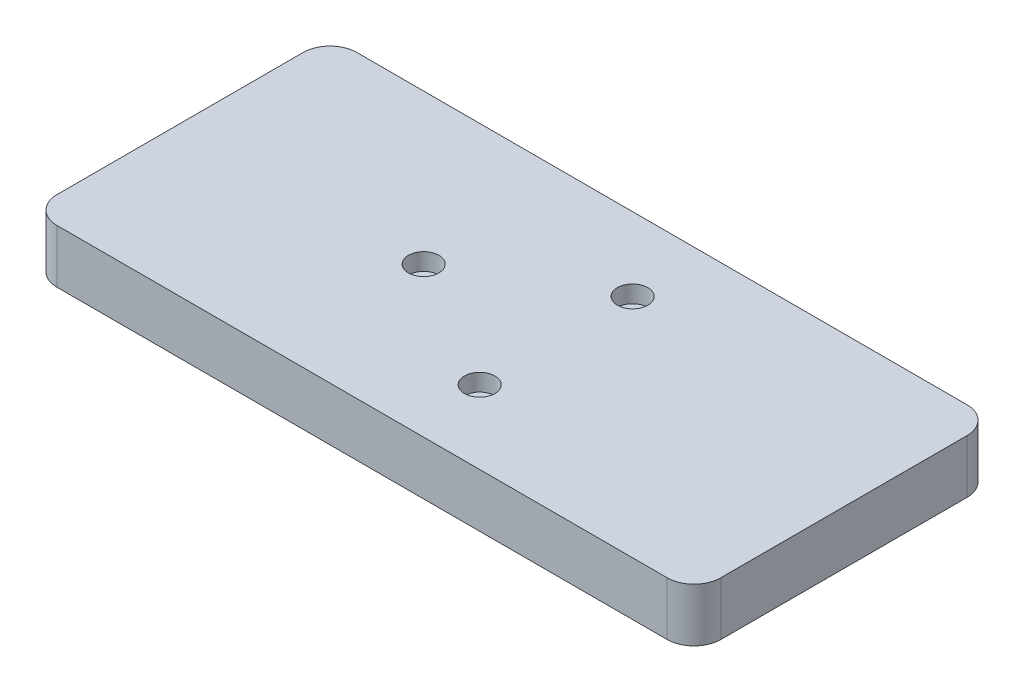
ISO-10303-21;
HEADER;
FILE_DESCRIPTION(('STEP AP214'),'2;1');
FILE_NAME('part.step','',(''),(''),'','','');
FILE_SCHEMA(('AUTOMOTIVE_DESIGN { 1 0 10303 214 1 1 1 1 }'));
ENDSEC;
DATA;
#1=APPLICATION_CONTEXT('core data for automotive mechanical design processes');
#2=APPLICATION_PROTOCOL_DEFINITION('international standard','automotive_design',2000,#1);
#3=PRODUCT_CONTEXT('',#1,'mechanical');
#4=PRODUCT('Part','Part','',(#3));
#5=PRODUCT_RELATED_PRODUCT_CATEGORY('part','',(#4));
#6=PRODUCT_DEFINITION_FORMATION('','',#4);
#7=PRODUCT_DEFINITION_CONTEXT('part definition',#1,'design');
#8=PRODUCT_DEFINITION('design','',#6,#7);
#9=PRODUCT_DEFINITION_SHAPE('','',#8);
#10=(LENGTH_UNIT() NAMED_UNIT(*) SI_UNIT(.MILLI.,.METRE.));
#11=(NAMED_UNIT(*) PLANE_ANGLE_UNIT() SI_UNIT($,.RADIAN.));
#12=(NAMED_UNIT(*) SI_UNIT($,.STERADIAN.) SOLID_ANGLE_UNIT());
#13=UNCERTAINTY_MEASURE_WITH_UNIT(LENGTH_MEASURE(1.E-05),#10,'distance_accuracy_value','');
#14=(GEOMETRIC_REPRESENTATION_CONTEXT(3) GLOBAL_UNCERTAINTY_ASSIGNED_CONTEXT((#13)) GLOBAL_UNIT_ASSIGNED_CONTEXT((#10,
#11,#12)) REPRESENTATION_CONTEXT('',''));
#15=CARTESIAN_POINT('',(0.,0.,0.));
#16=DIRECTION('',(0.,0.,1.));
#17=DIRECTION('',(1.,0.,0.));
#18=AXIS2_PLACEMENT_3D('',#15,#16,#17);
#19=CARTESIAN_POINT('',(8.24999999999997,-0.000999999999999265,14.2894191624432));
#20=DIRECTION('',(0.,1.,0.));
#21=DIRECTION('',(0.,0.,1.));
#22=AXIS2_PLACEMENT_3D('',#19,#20,#21);
#23=CYLINDRICAL_SURFACE('',#22,1.55);
#24=CARTESIAN_POINT('',(8.24999999999997,0.,14.2894191624432));
#25=DIRECTION('',(0.,1.,0.));
#26=DIRECTION('',(0.,0.,1.));
#27=AXIS2_PLACEMENT_3D('',#24,#25,#26);
#28=CIRCLE('',#27,1.55);
#29=CARTESIAN_POINT('',(8.24999999999997,0.,15.8394191624432));
#30=VERTEX_POINT('',#29);
#31=EDGE_CURVE('E170',#30,#30,#28,.F.);
#32=ORIENTED_EDGE('',*,*,#31,.T.);
#33=EDGE_LOOP('',(#32));
#34=FACE_BOUND('',#33,.T.);
#35=CARTESIAN_POINT('',(8.24999999999997,6.8,14.2894191624432));
#36=DIRECTION('',(0.,1.,0.));
#37=DIRECTION('',(0.,0.,1.));
#38=AXIS2_PLACEMENT_3D('',#35,#36,#37);
#39=CIRCLE('',#38,1.55);
#40=CARTESIAN_POINT('',(8.24999999999997,6.8,15.8394191624432));
#41=VERTEX_POINT('',#40);
#42=EDGE_CURVE('E38',#41,#41,#39,.F.);
#43=ORIENTED_EDGE('',*,*,#42,.F.);
#44=EDGE_LOOP('',(#43));
#45=FACE_BOUND('',#44,.T.);
#46=ADVANCED_FACE('F34',(#34,#45),#23,.F.);
#47=CARTESIAN_POINT('',(8.24999999999996,-0.000999999999999265,-14.2894191624433));
#48=DIRECTION('',(0.,1.,0.));
#49=DIRECTION('',(0.,0.,1.));
#50=AXIS2_PLACEMENT_3D('',#47,#48,#49);
#51=CYLINDRICAL_SURFACE('',#50,1.55);
#52=CARTESIAN_POINT('',(8.24999999999996,0.,-14.2894191624433));
#53=DIRECTION('',(0.,1.,0.));
#54=DIRECTION('',(0.,0.,1.));
#55=AXIS2_PLACEMENT_3D('',#52,#53,#54);
#56=CIRCLE('',#55,1.55);
#57=CARTESIAN_POINT('',(8.24999999999996,0.,-12.7394191624433));
#58=VERTEX_POINT('',#57);
#59=EDGE_CURVE('E174',#58,#58,#56,.F.);
#60=ORIENTED_EDGE('',*,*,#59,.T.);
#61=EDGE_LOOP('',(#60));
#62=FACE_BOUND('',#61,.T.);
#63=CARTESIAN_POINT('',(8.24999999999996,6.8,-14.2894191624433));
#64=DIRECTION('',(0.,1.,0.));
#65=DIRECTION('',(0.,0.,1.));
#66=AXIS2_PLACEMENT_3D('',#63,#64,#65);
#67=CIRCLE('',#66,1.55);
#68=CARTESIAN_POINT('',(8.24999999999996,6.8,-12.7394191624433));
#69=VERTEX_POINT('',#68);
#70=EDGE_CURVE('E164',#69,#69,#67,.F.);
#71=ORIENTED_EDGE('',*,*,#70,.F.);
#72=EDGE_LOOP('',(#71));
#73=FACE_BOUND('',#72,.T.);
#74=ADVANCED_FACE('F216',(#62,#73),#51,.F.);
#75=CARTESIAN_POINT('',(-16.5,-0.000999999999999265,0.));
#76=DIRECTION('',(0.,1.,0.));
#77=DIRECTION('',(0.,0.,1.));
#78=AXIS2_PLACEMENT_3D('',#75,#76,#77);
#79=CYLINDRICAL_SURFACE('',#78,1.55);
#80=CARTESIAN_POINT('',(-16.5,0.,0.));
#81=DIRECTION('',(0.,1.,0.));
#82=DIRECTION('',(0.,0.,1.));
#83=AXIS2_PLACEMENT_3D('',#80,#81,#82);
#84=CIRCLE('',#83,1.55);
#85=CARTESIAN_POINT('',(-16.5,0.,1.55));
#86=VERTEX_POINT('',#85);
#87=EDGE_CURVE('E134',#86,#86,#84,.F.);
#88=ORIENTED_EDGE('',*,*,#87,.T.);
#89=EDGE_LOOP('',(#88));
#90=FACE_BOUND('',#89,.T.);
#91=CARTESIAN_POINT('',(-16.5,6.8,0.));
#92=DIRECTION('',(0.,1.,0.));
#93=DIRECTION('',(0.,0.,1.));
#94=AXIS2_PLACEMENT_3D('',#91,#92,#93);
#95=CIRCLE('',#94,1.55);
#96=CARTESIAN_POINT('',(-16.5,6.8,1.55));
#97=VERTEX_POINT('',#96);
#98=EDGE_CURVE('E162',#97,#97,#95,.F.);
#99=ORIENTED_EDGE('',*,*,#98,.F.);
#100=EDGE_LOOP('',(#99));
#101=FACE_BOUND('',#100,.T.);
#102=ADVANCED_FACE('F221',(#90,#101),#79,.F.);
#103=CARTESIAN_POINT('',(-62.,10.,-28.));
#104=DIRECTION('',(0.,0.,1.));
#105=DIRECTION('',(1.,0.,0.));
#106=AXIS2_PLACEMENT_3D('',#103,#104,#105);
#107=PLANE('',#106);
#108=DIRECTION('',(-1.,0.,0.));
#109=VECTOR('',#108,1.);
#110=CARTESIAN_POINT('',(-62.,0.,-28.));
#111=LINE('',#110,#109);
#112=CARTESIAN_POINT('',(57.,0.,-28.));
#113=VERTEX_POINT('',#112);
#114=CARTESIAN_POINT('',(-57.,0.,-28.));
#115=VERTEX_POINT('',#114);
#116=EDGE_CURVE('E129',#113,#115,#111,.T.);
#117=ORIENTED_EDGE('',*,*,#116,.T.);
#118=DIRECTION('',(0.,-1.,0.));
#119=VECTOR('',#118,1.);
#120=CARTESIAN_POINT('',(-57.,10.,-28.));
#121=LINE('',#120,#119);
#122=CARTESIAN_POINT('',(-57.,10.,-28.));
#123=VERTEX_POINT('',#122);
#124=EDGE_CURVE('E107',#115,#123,#121,.F.);
#125=ORIENTED_EDGE('',*,*,#124,.T.);
#126=DIRECTION('',(-1.,0.,0.));
#127=VECTOR('',#126,1.);
#128=CARTESIAN_POINT('',(-62.,10.,-28.));
#129=LINE('',#128,#127);
#130=CARTESIAN_POINT('',(57.,10.,-28.));
#131=VERTEX_POINT('',#130);
#132=EDGE_CURVE('E139',#131,#123,#129,.T.);
#133=ORIENTED_EDGE('',*,*,#132,.F.);
#134=DIRECTION('',(0.,-1.,0.));
#135=VECTOR('',#134,1.);
#136=CARTESIAN_POINT('',(57.,10.,-28.));
#137=LINE('',#136,#135);
#138=EDGE_CURVE('E112',#131,#113,#137,.T.);
#139=ORIENTED_EDGE('',*,*,#138,.T.);
#140=EDGE_LOOP('',(#117,#125,#133,#139));
#141=FACE_BOUND('',#140,.T.);
#142=ADVANCED_FACE('F194',(#141),#107,.F.);
#143=CARTESIAN_POINT('',(-62.,10.,28.));
#144=DIRECTION('',(1.,0.,0.));
#145=DIRECTION('',(0.,0.,-1.));
#146=AXIS2_PLACEMENT_3D('',#143,#144,#145);
#147=PLANE('',#146);
#148=DIRECTION('',(0.,0.,1.));
#149=VECTOR('',#148,1.);
#150=CARTESIAN_POINT('',(-62.,10.,28.));
#151=LINE('',#150,#149);
#152=CARTESIAN_POINT('',(-62.,10.,-23.));
#153=VERTEX_POINT('',#152);
#154=CARTESIAN_POINT('',(-62.,10.,23.));
#155=VERTEX_POINT('',#154);
#156=EDGE_CURVE('E122',#153,#155,#151,.T.);
#157=ORIENTED_EDGE('',*,*,#156,.F.);
#158=DIRECTION('',(0.,-1.,0.));
#159=VECTOR('',#158,1.);
#160=CARTESIAN_POINT('',(-62.,10.,-23.));
#161=LINE('',#160,#159);
#162=CARTESIAN_POINT('',(-62.,0.,-23.));
#163=VERTEX_POINT('',#162);
#164=EDGE_CURVE('E106',#153,#163,#161,.T.);
#165=ORIENTED_EDGE('',*,*,#164,.T.);
#166=DIRECTION('',(0.,0.,1.));
#167=VECTOR('',#166,1.);
#168=CARTESIAN_POINT('',(-62.,0.,28.));
#169=LINE('',#168,#167);
#170=CARTESIAN_POINT('',(-62.,0.,23.));
#171=VERTEX_POINT('',#170);
#172=EDGE_CURVE('E119',#163,#171,#169,.T.);
#173=ORIENTED_EDGE('',*,*,#172,.T.);
#174=DIRECTION('',(0.,-1.,0.));
#175=VECTOR('',#174,1.);
#176=CARTESIAN_POINT('',(-62.,10.,23.));
#177=LINE('',#176,#175);
#178=EDGE_CURVE('E124',#171,#155,#177,.F.);
#179=ORIENTED_EDGE('',*,*,#178,.T.);
#180=EDGE_LOOP('',(#157,#165,#173,#179));
#181=FACE_BOUND('',#180,.T.);
#182=ADVANCED_FACE('F118',(#181),#147,.F.);
#183=CARTESIAN_POINT('',(-62.,10.,28.));
#184=DIRECTION('',(0.,0.,-1.));
#185=DIRECTION('',(-1.,0.,0.));
#186=AXIS2_PLACEMENT_3D('',#183,#184,#185);
#187=PLANE('',#186);
#188=DIRECTION('',(1.,0.,0.));
#189=VECTOR('',#188,1.);
#190=CARTESIAN_POINT('',(-62.,0.,28.));
#191=LINE('',#190,#189);
#192=CARTESIAN_POINT('',(-57.,0.,28.));
#193=VERTEX_POINT('',#192);
#194=CARTESIAN_POINT('',(57.,0.,28.));
#195=VERTEX_POINT('',#194);
#196=EDGE_CURVE('E128',#193,#195,#191,.T.);
#197=ORIENTED_EDGE('',*,*,#196,.T.);
#198=DIRECTION('',(0.,-1.,0.));
#199=VECTOR('',#198,1.);
#200=CARTESIAN_POINT('',(57.,10.,28.));
#201=LINE('',#200,#199);
#202=CARTESIAN_POINT('',(57.,10.,28.));
#203=VERTEX_POINT('',#202);
#204=EDGE_CURVE('E12',#195,#203,#201,.F.);
#205=ORIENTED_EDGE('',*,*,#204,.T.);
#206=DIRECTION('',(1.,0.,0.));
#207=VECTOR('',#206,1.);
#208=CARTESIAN_POINT('',(-62.,10.,28.));
#209=LINE('',#208,#207);
#210=CARTESIAN_POINT('',(-57.,10.,28.));
#211=VERTEX_POINT('',#210);
#212=EDGE_CURVE('E185',#211,#203,#209,.T.);
#213=ORIENTED_EDGE('',*,*,#212,.F.);
#214=DIRECTION('',(0.,-1.,0.));
#215=VECTOR('',#214,1.);
#216=CARTESIAN_POINT('',(-57.,10.,28.));
#217=LINE('',#216,#215);
#218=EDGE_CURVE('E43',#211,#193,#217,.T.);
#219=ORIENTED_EDGE('',*,*,#218,.T.);
#220=EDGE_LOOP('',(#197,#205,#213,#219));
#221=FACE_BOUND('',#220,.T.);
#222=ADVANCED_FACE('F201',(#221),#187,.F.);
#223=CARTESIAN_POINT('',(62.,10.,28.));
#224=DIRECTION('',(-1.,0.,0.));
#225=DIRECTION('',(0.,0.,1.));
#226=AXIS2_PLACEMENT_3D('',#223,#224,#225);
#227=PLANE('',#226);
#228=DIRECTION('',(0.,0.,-1.));
#229=VECTOR('',#228,1.);
#230=CARTESIAN_POINT('',(62.,0.,28.));
#231=LINE('',#230,#229);
#232=CARTESIAN_POINT('',(62.,0.,23.));
#233=VERTEX_POINT('',#232);
#234=CARTESIAN_POINT('',(62.,0.,-23.));
#235=VERTEX_POINT('',#234);
#236=EDGE_CURVE('E132',#233,#235,#231,.T.);
#237=ORIENTED_EDGE('',*,*,#236,.T.);
#238=DIRECTION('',(0.,-1.,0.));
#239=VECTOR('',#238,1.);
#240=CARTESIAN_POINT('',(62.,10.,-23.));
#241=LINE('',#240,#239);
#242=CARTESIAN_POINT('',(62.,10.,-23.));
#243=VERTEX_POINT('',#242);
#244=EDGE_CURVE('E51',#235,#243,#241,.F.);
#245=ORIENTED_EDGE('',*,*,#244,.T.);
#246=DIRECTION('',(0.,0.,-1.));
#247=VECTOR('',#246,1.);
#248=CARTESIAN_POINT('',(62.,10.,28.));
#249=LINE('',#248,#247);
#250=CARTESIAN_POINT('',(62.,10.,23.));
#251=VERTEX_POINT('',#250);
#252=EDGE_CURVE('E140',#251,#243,#249,.T.);
#253=ORIENTED_EDGE('',*,*,#252,.F.);
#254=DIRECTION('',(0.,-1.,0.));
#255=VECTOR('',#254,1.);
#256=CARTESIAN_POINT('',(62.,10.,23.));
#257=LINE('',#256,#255);
#258=EDGE_CURVE('E156',#251,#233,#257,.T.);
#259=ORIENTED_EDGE('',*,*,#258,.T.);
#260=EDGE_LOOP('',(#237,#245,#253,#259));
#261=FACE_BOUND('',#260,.T.);
#262=ADVANCED_FACE('F196',(#261),#227,.F.);
#263=CARTESIAN_POINT('',(0.,10.,0.));
#264=DIRECTION('',(0.,1.,0.));
#265=DIRECTION('',(0.,0.,1.));
#266=AXIS2_PLACEMENT_3D('',#263,#264,#265);
#267=PLANE('',#266);
#268=CARTESIAN_POINT('',(8.24999999999996,10.,-14.2894191624433));
#269=DIRECTION('',(0.,1.,0.));
#270=DIRECTION('',(0.,0.,1.));
#271=AXIS2_PLACEMENT_3D('',#268,#269,#270);
#272=CIRCLE('',#271,2.85);
#273=CARTESIAN_POINT('',(8.24999999999996,10.,-11.4394191624433));
#274=VERTEX_POINT('',#273);
#275=EDGE_CURVE('E371',#274,#274,#272,.T.);
#276=ORIENTED_EDGE('',*,*,#275,.F.);
#277=EDGE_LOOP('',(#276));
#278=FACE_BOUND('',#277,.T.);
#279=CARTESIAN_POINT('',(-16.5,10.,0.));
#280=DIRECTION('',(0.,1.,0.));
#281=DIRECTION('',(0.,0.,1.));
#282=AXIS2_PLACEMENT_3D('',#279,#280,#281);
#283=CIRCLE('',#282,2.85);
#284=CARTESIAN_POINT('',(-16.5,10.,2.85));
#285=VERTEX_POINT('',#284);
#286=EDGE_CURVE('E356',#285,#285,#283,.T.);
#287=ORIENTED_EDGE('',*,*,#286,.F.);
#288=EDGE_LOOP('',(#287));
#289=FACE_BOUND('',#288,.T.);
#290=CARTESIAN_POINT('',(8.24999999999997,10.,14.2894191624432));
#291=DIRECTION('',(0.,1.,0.));
#292=DIRECTION('',(0.,0.,1.));
#293=AXIS2_PLACEMENT_3D('',#290,#291,#292);
#294=CIRCLE('',#293,2.85);
#295=CARTESIAN_POINT('',(8.24999999999997,10.,17.1394191624432));
#296=VERTEX_POINT('',#295);
#297=EDGE_CURVE('E353',#296,#296,#294,.T.);
#298=ORIENTED_EDGE('',*,*,#297,.F.);
#299=EDGE_LOOP('',(#298));
#300=FACE_BOUND('',#299,.T.);
#301=ORIENTED_EDGE('',*,*,#132,.T.);
#302=CARTESIAN_POINT('',(-57.,10.,-23.));
#303=DIRECTION('',(0.,1.,0.));
#304=DIRECTION('',(0.,0.,1.));
#305=AXIS2_PLACEMENT_3D('',#302,#303,#304);
#306=CIRCLE('',#305,5.);
#307=EDGE_CURVE('E154',#123,#153,#306,.T.);
#308=ORIENTED_EDGE('',*,*,#307,.T.);
#309=ORIENTED_EDGE('',*,*,#156,.T.);
#310=CARTESIAN_POINT('',(-57.,10.,23.));
#311=DIRECTION('',(0.,1.,0.));
#312=DIRECTION('',(0.,0.,1.));
#313=AXIS2_PLACEMENT_3D('',#310,#311,#312);
#314=CIRCLE('',#313,5.);
#315=EDGE_CURVE('E149',#155,#211,#314,.T.);
#316=ORIENTED_EDGE('',*,*,#315,.T.);
#317=ORIENTED_EDGE('',*,*,#212,.T.);
#318=CARTESIAN_POINT('',(57.,10.,23.));
#319=DIRECTION('',(0.,1.,0.));
#320=DIRECTION('',(0.,0.,1.));
#321=AXIS2_PLACEMENT_3D('',#318,#319,#320);
#322=CIRCLE('',#321,5.);
#323=EDGE_CURVE('E58',#203,#251,#322,.T.);
#324=ORIENTED_EDGE('',*,*,#323,.T.);
#325=ORIENTED_EDGE('',*,*,#252,.T.);
#326=CARTESIAN_POINT('',(57.,10.,-23.));
#327=DIRECTION('',(0.,1.,0.));
#328=DIRECTION('',(0.,0.,1.));
#329=AXIS2_PLACEMENT_3D('',#326,#327,#328);
#330=CIRCLE('',#329,5.);
#331=EDGE_CURVE('E152',#243,#131,#330,.T.);
#332=ORIENTED_EDGE('',*,*,#331,.T.);
#333=EDGE_LOOP('',(#301,#308,#309,#316,#317,#324,#325,#332));
#334=FACE_BOUND('',#333,.T.);
#335=ADVANCED_FACE('F187',(#278,#289,#300,#334),#267,.T.);
#336=CARTESIAN_POINT('',(0.,0.,0.));
#337=DIRECTION('',(0.,1.,0.));
#338=DIRECTION('',(0.,0.,1.));
#339=AXIS2_PLACEMENT_3D('',#336,#337,#338);
#340=PLANE('',#339);
#341=ORIENTED_EDGE('',*,*,#87,.F.);
#342=EDGE_LOOP('',(#341));
#343=FACE_BOUND('',#342,.T.);
#344=ORIENTED_EDGE('',*,*,#59,.F.);
#345=EDGE_LOOP('',(#344));
#346=FACE_BOUND('',#345,.T.);
#347=ORIENTED_EDGE('',*,*,#31,.F.);
#348=EDGE_LOOP('',(#347));
#349=FACE_BOUND('',#348,.T.);
#350=ORIENTED_EDGE('',*,*,#172,.F.);
#351=CARTESIAN_POINT('',(-57.,0.,-23.));
#352=DIRECTION('',(0.,1.,0.));
#353=DIRECTION('',(0.,0.,1.));
#354=AXIS2_PLACEMENT_3D('',#351,#352,#353);
#355=CIRCLE('',#354,5.);
#356=EDGE_CURVE('E102',#163,#115,#355,.F.);
#357=ORIENTED_EDGE('',*,*,#356,.T.);
#358=ORIENTED_EDGE('',*,*,#116,.F.);
#359=CARTESIAN_POINT('',(57.,0.,-23.));
#360=DIRECTION('',(0.,1.,0.));
#361=DIRECTION('',(0.,0.,1.));
#362=AXIS2_PLACEMENT_3D('',#359,#360,#361);
#363=CIRCLE('',#362,5.);
#364=EDGE_CURVE('E113',#113,#235,#363,.F.);
#365=ORIENTED_EDGE('',*,*,#364,.T.);
#366=ORIENTED_EDGE('',*,*,#236,.F.);
#367=CARTESIAN_POINT('',(57.,0.,23.));
#368=DIRECTION('',(0.,1.,0.));
#369=DIRECTION('',(0.,0.,1.));
#370=AXIS2_PLACEMENT_3D('',#367,#368,#369);
#371=CIRCLE('',#370,5.);
#372=EDGE_CURVE('E143',#233,#195,#371,.F.);
#373=ORIENTED_EDGE('',*,*,#372,.T.);
#374=ORIENTED_EDGE('',*,*,#196,.F.);
#375=CARTESIAN_POINT('',(-57.,0.,23.));
#376=DIRECTION('',(0.,1.,0.));
#377=DIRECTION('',(0.,0.,1.));
#378=AXIS2_PLACEMENT_3D('',#375,#376,#377);
#379=CIRCLE('',#378,5.);
#380=EDGE_CURVE('E123',#193,#171,#379,.F.);
#381=ORIENTED_EDGE('',*,*,#380,.T.);
#382=EDGE_LOOP('',(#350,#357,#358,#365,#366,#373,#374,#381));
#383=FACE_BOUND('',#382,.T.);
#384=ADVANCED_FACE('F126',(#343,#346,#349,#383),#340,.F.);
#385=CARTESIAN_POINT('',(-57.,10.,-23.));
#386=DIRECTION('',(0.,-1.,0.));
#387=DIRECTION('',(0.,0.,-1.));
#388=AXIS2_PLACEMENT_3D('',#385,#386,#387);
#389=CYLINDRICAL_SURFACE('',#388,5.);
#390=ORIENTED_EDGE('',*,*,#307,.F.);
#391=ORIENTED_EDGE('',*,*,#124,.F.);
#392=ORIENTED_EDGE('',*,*,#356,.F.);
#393=ORIENTED_EDGE('',*,*,#164,.F.);
#394=EDGE_LOOP('',(#390,#391,#392,#393));
#395=FACE_BOUND('',#394,.T.);
#396=ADVANCED_FACE('F105',(#395),#389,.T.);
#397=CARTESIAN_POINT('',(57.,10.,-23.));
#398=DIRECTION('',(0.,-1.,0.));
#399=DIRECTION('',(0.,0.,-1.));
#400=AXIS2_PLACEMENT_3D('',#397,#398,#399);
#401=CYLINDRICAL_SURFACE('',#400,5.);
#402=ORIENTED_EDGE('',*,*,#331,.F.);
#403=ORIENTED_EDGE('',*,*,#244,.F.);
#404=ORIENTED_EDGE('',*,*,#364,.F.);
#405=ORIENTED_EDGE('',*,*,#138,.F.);
#406=EDGE_LOOP('',(#402,#403,#404,#405));
#407=FACE_BOUND('',#406,.T.);
#408=ADVANCED_FACE('F192',(#407),#401,.T.);
#409=CARTESIAN_POINT('',(57.,10.,23.));
#410=DIRECTION('',(0.,-1.,0.));
#411=DIRECTION('',(0.,0.,-1.));
#412=AXIS2_PLACEMENT_3D('',#409,#410,#411);
#413=CYLINDRICAL_SURFACE('',#412,5.);
#414=ORIENTED_EDGE('',*,*,#323,.F.);
#415=ORIENTED_EDGE('',*,*,#204,.F.);
#416=ORIENTED_EDGE('',*,*,#372,.F.);
#417=ORIENTED_EDGE('',*,*,#258,.F.);
#418=EDGE_LOOP('',(#414,#415,#416,#417));
#419=FACE_BOUND('',#418,.T.);
#420=ADVANCED_FACE('F198',(#419),#413,.T.);
#421=CARTESIAN_POINT('',(-57.,10.,23.));
#422=DIRECTION('',(0.,-1.,0.));
#423=DIRECTION('',(0.,0.,-1.));
#424=AXIS2_PLACEMENT_3D('',#421,#422,#423);
#425=CYLINDRICAL_SURFACE('',#424,5.);
#426=ORIENTED_EDGE('',*,*,#315,.F.);
#427=ORIENTED_EDGE('',*,*,#178,.F.);
#428=ORIENTED_EDGE('',*,*,#380,.F.);
#429=ORIENTED_EDGE('',*,*,#218,.F.);
#430=EDGE_LOOP('',(#426,#427,#428,#429));
#431=FACE_BOUND('',#430,.T.);
#432=ADVANCED_FACE('F36',(#431),#425,.T.);
#433=CARTESIAN_POINT('',(0.,6.8,0.));
#434=DIRECTION('',(0.,1.,0.));
#435=DIRECTION('',(0.,0.,1.));
#436=AXIS2_PLACEMENT_3D('',#433,#434,#435);
#437=PLANE('',#436);
#438=CARTESIAN_POINT('',(-16.5,6.8,0.));
#439=DIRECTION('',(0.,1.,0.));
#440=DIRECTION('',(0.,0.,1.));
#441=AXIS2_PLACEMENT_3D('',#438,#439,#440);
#442=CIRCLE('',#441,2.85);
#443=CARTESIAN_POINT('',(-16.5,6.8,2.85));
#444=VERTEX_POINT('',#443);
#445=EDGE_CURVE('E359',#444,#444,#442,.F.);
#446=ORIENTED_EDGE('',*,*,#445,.F.);
#447=EDGE_LOOP('',(#446));
#448=FACE_BOUND('',#447,.T.);
#449=ORIENTED_EDGE('',*,*,#98,.T.);
#450=EDGE_LOOP('',(#449));
#451=FACE_BOUND('',#450,.T.);
#452=ADVANCED_FACE('F207',(#448,#451),#437,.T.);
#453=CARTESIAN_POINT('',(-16.5,-8.06101730552664,0.));
#454=DIRECTION('',(0.,1.,0.));
#455=DIRECTION('',(0.,0.,1.));
#456=AXIS2_PLACEMENT_3D('',#453,#454,#455);
#457=CYLINDRICAL_SURFACE('',#456,2.85);
#458=ORIENTED_EDGE('',*,*,#445,.T.);
#459=EDGE_LOOP('',(#458));
#460=FACE_BOUND('',#459,.T.);
#461=ORIENTED_EDGE('',*,*,#286,.T.);
#462=EDGE_LOOP('',(#461));
#463=FACE_BOUND('',#462,.T.);
#464=ADVANCED_FACE('F212',(#460,#463),#457,.F.);
#465=CARTESIAN_POINT('',(0.,6.8,0.));
#466=DIRECTION('',(0.,1.,0.));
#467=DIRECTION('',(0.,0.,1.));
#468=AXIS2_PLACEMENT_3D('',#465,#466,#467);
#469=PLANE('',#468);
#470=CARTESIAN_POINT('',(8.24999999999996,6.8,-14.2894191624433));
#471=DIRECTION('',(0.,1.,0.));
#472=DIRECTION('',(0.,0.,1.));
#473=AXIS2_PLACEMENT_3D('',#470,#471,#472);
#474=CIRCLE('',#473,2.85);
#475=CARTESIAN_POINT('',(8.24999999999996,6.8,-11.4394191624433));
#476=VERTEX_POINT('',#475);
#477=EDGE_CURVE('E165',#476,#476,#474,.F.);
#478=ORIENTED_EDGE('',*,*,#477,.F.);
#479=EDGE_LOOP('',(#478));
#480=FACE_BOUND('',#479,.T.);
#481=ORIENTED_EDGE('',*,*,#70,.T.);
#482=EDGE_LOOP('',(#481));
#483=FACE_BOUND('',#482,.T.);
#484=ADVANCED_FACE('F303',(#480,#483),#469,.T.);
#485=CARTESIAN_POINT('',(8.24999999999996,-8.06101730552664,-14.2894191624433));
#486=DIRECTION('',(0.,1.,0.));
#487=DIRECTION('',(0.,0.,1.));
#488=AXIS2_PLACEMENT_3D('',#485,#486,#487);
#489=CYLINDRICAL_SURFACE('',#488,2.85);
#490=ORIENTED_EDGE('',*,*,#477,.T.);
#491=EDGE_LOOP('',(#490));
#492=FACE_BOUND('',#491,.T.);
#493=ORIENTED_EDGE('',*,*,#275,.T.);
#494=EDGE_LOOP('',(#493));
#495=FACE_BOUND('',#494,.T.);
#496=ADVANCED_FACE('F313',(#492,#495),#489,.F.);
#497=CARTESIAN_POINT('',(0.,6.8,0.));
#498=DIRECTION('',(0.,1.,0.));
#499=DIRECTION('',(0.,0.,1.));
#500=AXIS2_PLACEMENT_3D('',#497,#498,#499);
#501=PLANE('',#500);
#502=CARTESIAN_POINT('',(8.24999999999997,6.8,14.2894191624432));
#503=DIRECTION('',(0.,1.,0.));
#504=DIRECTION('',(0.,0.,1.));
#505=AXIS2_PLACEMENT_3D('',#502,#503,#504);
#506=CIRCLE('',#505,2.85);
#507=CARTESIAN_POINT('',(8.24999999999997,6.8,17.1394191624432));
#508=VERTEX_POINT('',#507);
#509=EDGE_CURVE('E350',#508,#508,#506,.F.);
#510=ORIENTED_EDGE('',*,*,#509,.F.);
#511=EDGE_LOOP('',(#510));
#512=FACE_BOUND('',#511,.T.);
#513=ORIENTED_EDGE('',*,*,#42,.T.);
#514=EDGE_LOOP('',(#513));
#515=FACE_BOUND('',#514,.T.);
#516=ADVANCED_FACE('F323',(#512,#515),#501,.T.);
#517=CARTESIAN_POINT('',(8.24999999999997,-8.06101730552664,14.2894191624432));
#518=DIRECTION('',(0.,1.,0.));
#519=DIRECTION('',(0.,0.,1.));
#520=AXIS2_PLACEMENT_3D('',#517,#518,#519);
#521=CYLINDRICAL_SURFACE('',#520,2.85);
#522=ORIENTED_EDGE('',*,*,#509,.T.);
#523=EDGE_LOOP('',(#522));
#524=FACE_BOUND('',#523,.T.);
#525=ORIENTED_EDGE('',*,*,#297,.T.);
#526=EDGE_LOOP('',(#525));
#527=FACE_BOUND('',#526,.T.);
#528=ADVANCED_FACE('F333',(#524,#527),#521,.F.);
#529=CLOSED_SHELL('',(#46,#74,#102,#142,#182,#222,#262,#335,#384,#396,#408,#420,#432,#452,#464,
#484,#496,#516,#528));
#530=MANIFOLD_SOLID_BREP('B2',#529);
#531=ADVANCED_BREP_SHAPE_REPRESENTATION('',(#18,#530),#14);
#532=SHAPE_DEFINITION_REPRESENTATION(#9,#531);
ENDSEC;
END-ISO-10303-21;
